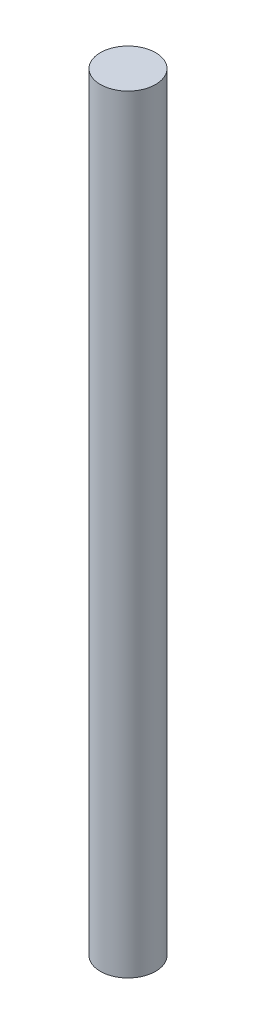
ISO-10303-21;
HEADER;
FILE_DESCRIPTION(('STEP AP214'),'2;1');
FILE_NAME('part.step','',(''),(''),'','','');
FILE_SCHEMA(('AUTOMOTIVE_DESIGN { 1 0 10303 214 1 1 1 1 }'));
ENDSEC;
DATA;
#1=APPLICATION_CONTEXT('core data for automotive mechanical design processes');
#2=APPLICATION_PROTOCOL_DEFINITION('international standard','automotive_design',2000,#1);
#3=PRODUCT_CONTEXT('',#1,'mechanical');
#4=PRODUCT('Part','Part','',(#3));
#5=PRODUCT_RELATED_PRODUCT_CATEGORY('part','',(#4));
#6=PRODUCT_DEFINITION_FORMATION('','',#4);
#7=PRODUCT_DEFINITION_CONTEXT('part definition',#1,'design');
#8=PRODUCT_DEFINITION('design','',#6,#7);
#9=PRODUCT_DEFINITION_SHAPE('','',#8);
#10=(LENGTH_UNIT() NAMED_UNIT(*) SI_UNIT(.MILLI.,.METRE.));
#11=(NAMED_UNIT(*) PLANE_ANGLE_UNIT() SI_UNIT($,.RADIAN.));
#12=(NAMED_UNIT(*) SI_UNIT($,.STERADIAN.) SOLID_ANGLE_UNIT());
#13=UNCERTAINTY_MEASURE_WITH_UNIT(LENGTH_MEASURE(1.E-05),#10,'distance_accuracy_value','');
#14=(GEOMETRIC_REPRESENTATION_CONTEXT(3) GLOBAL_UNCERTAINTY_ASSIGNED_CONTEXT((#13)) GLOBAL_UNIT_ASSIGNED_CONTEXT((#10,
#11,#12)) REPRESENTATION_CONTEXT('',''));
#15=CARTESIAN_POINT('',(0.,0.,0.));
#16=DIRECTION('',(0.,0.,1.));
#17=DIRECTION('',(1.,0.,0.));
#18=AXIS2_PLACEMENT_3D('',#15,#16,#17);
#19=CARTESIAN_POINT('',(0.,68.13,0.));
#20=DIRECTION('',(0.,-1.,0.));
#21=DIRECTION('',(0.,0.,-1.));
#22=AXIS2_PLACEMENT_3D('',#19,#20,#21);
#23=CYLINDRICAL_SURFACE('',#22,2.45);
#24=CARTESIAN_POINT('',(0.,68.13,0.));
#25=DIRECTION('',(0.,1.,0.));
#26=DIRECTION('',(0.,0.,1.));
#27=AXIS2_PLACEMENT_3D('',#24,#25,#26);
#28=CIRCLE('',#27,2.45);
#29=CARTESIAN_POINT('',(0.,68.13,2.45));
#30=VERTEX_POINT('',#29);
#31=EDGE_CURVE('E10',#30,#30,#28,.T.);
#32=ORIENTED_EDGE('',*,*,#31,.F.);
#33=EDGE_LOOP('',(#32));
#34=FACE_BOUND('',#33,.T.);
#35=CARTESIAN_POINT('',(0.,0.,0.));
#36=DIRECTION('',(0.,1.,0.));
#37=DIRECTION('',(0.,0.,1.));
#38=AXIS2_PLACEMENT_3D('',#35,#36,#37);
#39=CIRCLE('',#38,2.45);
#40=CARTESIAN_POINT('',(0.,0.,2.45));
#41=VERTEX_POINT('',#40);
#42=EDGE_CURVE('E36',#41,#41,#39,.T.);
#43=ORIENTED_EDGE('',*,*,#42,.T.);
#44=EDGE_LOOP('',(#43));
#45=FACE_BOUND('',#44,.T.);
#46=ADVANCED_FACE('F33',(#34,#45),#23,.T.);
#47=CARTESIAN_POINT('',(0.,68.13,0.));
#48=DIRECTION('',(0.,1.,0.));
#49=DIRECTION('',(0.,0.,1.));
#50=AXIS2_PLACEMENT_3D('',#47,#48,#49);
#51=PLANE('',#50);
#52=ORIENTED_EDGE('',*,*,#31,.T.);
#53=EDGE_LOOP('',(#52));
#54=FACE_BOUND('',#53,.T.);
#55=ADVANCED_FACE('F48',(#54),#51,.T.);
#56=CARTESIAN_POINT('',(0.,0.,0.));
#57=DIRECTION('',(0.,1.,0.));
#58=DIRECTION('',(0.,0.,1.));
#59=AXIS2_PLACEMENT_3D('',#56,#57,#58);
#60=PLANE('',#59);
#61=ORIENTED_EDGE('',*,*,#42,.F.);
#62=EDGE_LOOP('',(#61));
#63=FACE_BOUND('',#62,.T.);
#64=ADVANCED_FACE('F46',(#63),#60,.F.);
#65=CLOSED_SHELL('',(#46,#55,#64));
#66=MANIFOLD_SOLID_BREP('B2',#65);
#67=ADVANCED_BREP_SHAPE_REPRESENTATION('',(#18,#66),#14);
#68=SHAPE_DEFINITION_REPRESENTATION(#9,#67);
ENDSEC;
END-ISO-10303-21;
